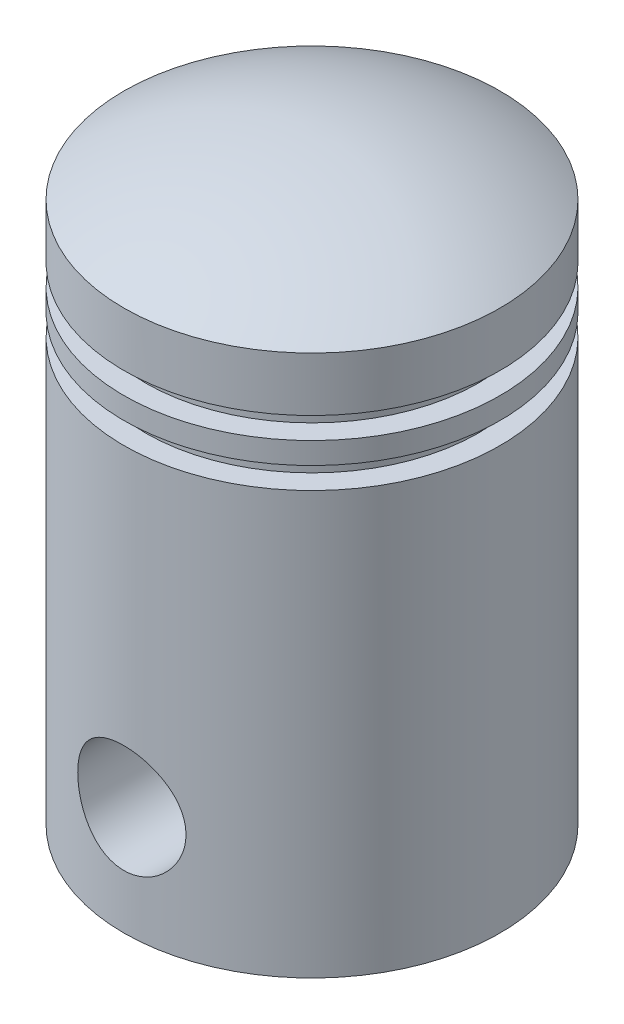
ISO-10303-21;
HEADER;
FILE_DESCRIPTION(('STEP AP214'),'2;1');
FILE_NAME('part.step','',(''),(''),'','','');
FILE_SCHEMA(('AUTOMOTIVE_DESIGN { 1 0 10303 214 1 1 1 1 }'));
ENDSEC;
DATA;
#1=APPLICATION_CONTEXT('core data for automotive mechanical design processes');
#2=APPLICATION_PROTOCOL_DEFINITION('international standard','automotive_design',2000,#1);
#3=PRODUCT_CONTEXT('',#1,'mechanical');
#4=PRODUCT('Part','Part','',(#3));
#5=PRODUCT_RELATED_PRODUCT_CATEGORY('part','',(#4));
#6=PRODUCT_DEFINITION_FORMATION('','',#4);
#7=PRODUCT_DEFINITION_CONTEXT('part definition',#1,'design');
#8=PRODUCT_DEFINITION('design','',#6,#7);
#9=PRODUCT_DEFINITION_SHAPE('','',#8);
#10=(LENGTH_UNIT() NAMED_UNIT(*) SI_UNIT(.MILLI.,.METRE.));
#11=(NAMED_UNIT(*) PLANE_ANGLE_UNIT() SI_UNIT($,.RADIAN.));
#12=(NAMED_UNIT(*) SI_UNIT($,.STERADIAN.) SOLID_ANGLE_UNIT());
#13=UNCERTAINTY_MEASURE_WITH_UNIT(LENGTH_MEASURE(1.E-05),#10,'distance_accuracy_value','');
#14=(GEOMETRIC_REPRESENTATION_CONTEXT(3) GLOBAL_UNCERTAINTY_ASSIGNED_CONTEXT((#13)) GLOBAL_UNIT_ASSIGNED_CONTEXT((#10,
#11,#12)) REPRESENTATION_CONTEXT('',''));
#15=CARTESIAN_POINT('',(0.,0.,0.));
#16=DIRECTION('',(0.,0.,1.));
#17=DIRECTION('',(1.,0.,0.));
#18=AXIS2_PLACEMENT_3D('',#15,#16,#17);
#19=CARTESIAN_POINT('',(0.,10.,61.));
#20=DIRECTION('',(0.,0.,-1.));
#21=DIRECTION('',(-1.,0.,0.));
#22=AXIS2_PLACEMENT_3D('',#19,#20,#21);
#23=CYLINDRICAL_SURFACE('',#22,5.);
#24=CARTESIAN_POINT('',(0.,15.,-17.375));
#25=CARTESIAN_POINT('',(0.274803665797188,14.9999953560896,-17.3749968494518));
#26=CARTESIAN_POINT('',(0.549654910382217,14.9772694129235,-17.3684175083818));
#27=CARTESIAN_POINT('',(1.09138590574731,14.8871608838095,-17.3428124485425));
#28=CARTESIAN_POINT('',(1.35826269308548,14.8197619071053,-17.3237821614929));
#29=CARTESIAN_POINT('',(1.87615076094793,14.6427203108892,-17.2753662325862));
#30=CARTESIAN_POINT('',(2.12718377001475,14.5331370766044,-17.2459951530051));
#31=CARTESIAN_POINT('',(2.60731151759561,14.2750724110926,-17.1799696757991));
#32=CARTESIAN_POINT('',(2.83640386715536,14.1265867506317,-17.143314486395));
#33=CARTESIAN_POINT('',(3.27224872741674,13.7907616582188,-17.0655570761435));
#34=CARTESIAN_POINT('',(3.47833400601289,13.6025761024138,-17.0243693110133));
#35=CARTESIAN_POINT('',(3.8564991987516,13.194498405289,-16.9427136059819));
#36=CARTESIAN_POINT('',(4.02857392886535,12.974601439206,-16.9022457766704));
#37=CARTESIAN_POINT('',(4.33724570475069,12.5038192408422,-16.8257185179076));
#38=CARTESIAN_POINT('',(4.47304620199927,12.2523927423824,-16.7897660310383));
#39=CARTESIAN_POINT('',(4.70017262956097,11.7290713461433,-16.7276109002903));
#40=CARTESIAN_POINT('',(4.79150828292429,11.4571809381989,-16.7014061251925));
#41=CARTESIAN_POINT('',(4.92473989845127,10.9081048394319,-16.6626017589769));
#42=CARTESIAN_POINT('',(4.96785845141203,10.6312401464834,-16.6496664483674));
#43=CARTESIAN_POINT('',(5.00724747654957,10.0739277355271,-16.6378651769945));
#44=CARTESIAN_POINT('',(5.00352829112999,9.79348082218466,-16.6389961102142));
#45=CARTESIAN_POINT('',(4.95031158965818,9.24675164295637,-16.6549008792998));
#46=CARTESIAN_POINT('',(4.90232539797121,8.9803070299427,-16.6692242843738));
#47=CARTESIAN_POINT('',(4.76437056984278,8.45942168190412,-16.7091742550488));
#48=CARTESIAN_POINT('',(4.67439808899332,8.20498204844571,-16.7348018556888));
#49=CARTESIAN_POINT('',(4.45386726986537,7.71154102885447,-16.7948457986021));
#50=CARTESIAN_POINT('',(4.32280387035666,7.47277911364038,-16.8293705023842));
#51=CARTESIAN_POINT('',(4.02416306710636,7.02012156271584,-16.903264184722));
#52=CARTESIAN_POINT('',(3.8565774315096,6.80623154965192,-16.942634254517));
#53=CARTESIAN_POINT('',(3.48205907244744,6.40079264769588,-17.0236278293043));
#54=CARTESIAN_POINT('',(3.27386628876869,6.21041156572744,-17.06527992096));
#55=CARTESIAN_POINT('',(2.8279925176001,5.86700557845638,-17.1448036671692));
#56=CARTESIAN_POINT('',(2.59030995870876,5.71398266512344,-17.1826751200722));
#57=CARTESIAN_POINT('',(2.09020090010304,5.44900310992496,-17.2506709154384));
#58=CARTESIAN_POINT('',(1.8276401476164,5.33728733450106,-17.2807495217852));
#59=CARTESIAN_POINT('',(1.28639428172884,5.15993467177116,-17.3294410244882));
#60=CARTESIAN_POINT('',(1.00771331318962,5.09428599610606,-17.3480568539667));
#61=CARTESIAN_POINT('',(0.452079988277045,5.01283308954668,-17.3712690450966));
#62=CARTESIAN_POINT('',(0.175378174945523,4.99544432565985,-17.3763109123619));
#63=CARTESIAN_POINT('',(-0.376998979302229,5.00658842814801,-17.3731041770712));
#64=CARTESIAN_POINT('',(-0.652674441217238,5.035115697726,-17.3648571943195));
#65=CARTESIAN_POINT('',(-1.1893163258651,5.13599318072851,-17.3362897283603));
#66=CARTESIAN_POINT('',(-1.4504683981028,5.20743347320087,-17.3162200968852));
#67=CARTESIAN_POINT('',(-1.95703641016133,5.39102883408685,-17.2663103340338));
#68=CARTESIAN_POINT('',(-2.20245051514497,5.50318863973554,-17.2364690658825));
#69=CARTESIAN_POINT('',(-2.6765310907252,5.76780378273363,-17.1693163144329));
#70=CARTESIAN_POINT('',(-2.90471403653448,5.92108657440245,-17.1318557589579));
#71=CARTESIAN_POINT('',(-3.33266570638841,6.26257835358831,-17.0537785628933));
#72=CARTESIAN_POINT('',(-3.5324278540059,6.45079540156883,-17.0131611951847));
#73=CARTESIAN_POINT('',(-3.9047337965831,6.86424327683104,-16.9316641750232));
#74=CARTESIAN_POINT('',(-4.07615310497886,7.09049589564904,-16.8908206239896));
#75=CARTESIAN_POINT('',(-4.37864968226352,7.56943764128848,-16.8149475744567));
#76=CARTESIAN_POINT('',(-4.50972831281051,7.82212587541707,-16.7799178797349));
#77=CARTESIAN_POINT('',(-4.72687354444111,8.34574825765644,-16.7200475770686));
#78=CARTESIAN_POINT('',(-4.81317522838912,8.61657850793913,-16.695153905687));
#79=CARTESIAN_POINT('',(-4.93873352147709,9.16976484134921,-16.6584482338485));
#80=CARTESIAN_POINT('',(-4.97800464385883,9.45211734097863,-16.6466321978272));
#81=CARTESIAN_POINT('',(-5.00745569115569,10.0087180914069,-16.6377948518647));
#82=CARTESIAN_POINT('',(-4.99945838965416,10.282862499954,-16.6402241803358));
#83=CARTESIAN_POINT('',(-4.93890404282926,10.8257186476803,-16.6582960895213));
#84=CARTESIAN_POINT('',(-4.88634852483817,11.0944305727467,-16.6739382173373));
#85=CARTESIAN_POINT('',(-4.73930282057359,11.6160755991456,-16.7163199191876));
#86=CARTESIAN_POINT('',(-4.64525867530073,11.869144736796,-16.7429412633489));
#87=CARTESIAN_POINT('',(-4.41825049647195,12.3561128298642,-16.8042687775746));
#88=CARTESIAN_POINT('',(-4.28527949255895,12.5900083423871,-16.8389763953635));
#89=CARTESIAN_POINT('',(-3.97892003422897,13.0405411977054,-16.9140313076714));
#90=CARTESIAN_POINT('',(-3.8043167626329,13.2563273515792,-16.9545296367241));
#91=CARTESIAN_POINT('',(-3.42188242030569,13.6561284623108,-17.0358299573731));
#92=CARTESIAN_POINT('',(-3.21404295847298,13.8401353714334,-17.0766320231666));
#93=CARTESIAN_POINT('',(-2.76448476451399,14.1759271210124,-17.1552206448432));
#94=CARTESIAN_POINT('',(-2.52202224147647,14.3267435748773,-17.1929004497483));
#95=CARTESIAN_POINT('',(-2.01409873033801,14.5852487174374,-17.259764276906));
#96=CARTESIAN_POINT('',(-1.74865015139603,14.6929605020505,-17.2889528465527));
#97=CARTESIAN_POINT('',(-1.23748735581801,14.85084986106,-17.33252456407));
#98=CARTESIAN_POINT('',(-0.993614127241907,14.9066381343212,-17.3483272895209));
#99=CARTESIAN_POINT('',(-0.49983982676936,14.9812127592001,-17.3695657239762));
#100=CARTESIAN_POINT('',(-0.249939592630444,15.0000042237321,-17.3750028654884));
#101=CARTESIAN_POINT('',(0.,15.,-17.375));
#102=B_SPLINE_CURVE_WITH_KNOTS('',3,(#24,#25,#26,#27,#28,#29,#30,#31,#32,#33,#34,#35,#36,#37,
#38,#39,#40,#41,#42,#43,#44,#45,#46,#47,#48,#49,#50,#51,#52,#53,#54,#55,#56,#57,#58,#59,#60,#61,
#62,#63,#64,#65,#66,#67,#68,#69,#70,#71,#72,#73,#74,#75,#76,#77,#78,#79,#80,#81,#82,#83,#84,#85,
#86,#87,#88,#89,#90,#91,#92,#93,#94,#95,#96,#97,#98,#99,#100,#101),.UNSPECIFIED.,.T.,.F.,(4,2,2,
2,2,2,2,2,2,2,2,2,2,2,2,2,2,2,2,2,2,2,2,2,2,2,2,2,2,2,2,2,2,2,2,2,2,2,4),(0.,0.823493485504367,
1.64728928220667,2.4699295899075,3.29265936716686,4.13511290685633,4.97769475794746,
5.83748893163841,6.69709501108777,7.53437245641936,8.37146502285351,9.18099557035016,
9.99060025577631,10.8105742965049,11.6307333451127,12.4822703526944,13.3338527550502,
14.1903253146117,15.0465786267794,15.8743655845801,16.7020516494168,17.5127782071142,
18.3235991135241,19.1521489324596,19.9808901628427,20.8371589367264,21.6933988049678,
22.5450966544535,23.3965316092562,24.2153531477136,25.0341466203709,25.844344041214,
26.6546866272063,27.4924347474249,28.3303947078152,29.1902663485709,30.0496766425374,
30.7987644547742,31.5477487367113),.UNSPECIFIED.);
#103=CARTESIAN_POINT('',(0.,15.,-17.375));
#104=VERTEX_POINT('',#103);
#105=EDGE_CURVE('E157',#104,#104,#102,.T.);
#106=ORIENTED_EDGE('',*,*,#105,.T.);
#107=EDGE_LOOP('',(#106));
#108=FACE_BOUND('',#107,.T.);
#109=CARTESIAN_POINT('',(0.,10.,-5.25));
#110=DIRECTION('',(0.,0.,1.));
#111=DIRECTION('',(1.,0.,0.));
#112=AXIS2_PLACEMENT_3D('',#109,#110,#111);
#113=CIRCLE('',#112,5.);
#114=CARTESIAN_POINT('',(5.,10.,-5.25));
#115=VERTEX_POINT('',#114);
#116=EDGE_CURVE('E53',#115,#115,#113,.T.);
#117=ORIENTED_EDGE('',*,*,#116,.T.);
#118=EDGE_LOOP('',(#117));
#119=FACE_BOUND('',#118,.T.);
#120=ADVANCED_FACE('F43',(#108,#119),#23,.F.);
#121=CARTESIAN_POINT('',(0.,30.,0.));
#122=DIRECTION('',(0.,-1.,0.));
#123=DIRECTION('',(0.,0.,-1.));
#124=AXIS2_PLACEMENT_3D('',#121,#122,#123);
#125=CYLINDRICAL_SURFACE('',#124,17.375);
#126=CARTESIAN_POINT('',(0.,39.,0.));
#127=DIRECTION('',(0.,1.,0.));
#128=DIRECTION('',(-1.,0.,0.));
#129=AXIS2_PLACEMENT_3D('',#126,#127,#128);
#130=CIRCLE('',#129,17.375);
#131=CARTESIAN_POINT('',(-17.375,39.,0.));
#132=VERTEX_POINT('',#131);
#133=EDGE_CURVE('E231',#132,#132,#130,.T.);
#134=ORIENTED_EDGE('',*,*,#133,.F.);
#135=EDGE_LOOP('',(#134));
#136=FACE_BOUND('',#135,.T.);
#137=CARTESIAN_POINT('',(0.,0.,0.));
#138=DIRECTION('',(0.,1.,0.));
#139=DIRECTION('',(0.,0.,1.));
#140=AXIS2_PLACEMENT_3D('',#137,#138,#139);
#141=CIRCLE('',#140,17.375);
#142=CARTESIAN_POINT('',(0.,0.,17.375));
#143=VERTEX_POINT('',#142);
#144=EDGE_CURVE('E146',#143,#143,#141,.T.);
#145=ORIENTED_EDGE('',*,*,#144,.T.);
#146=EDGE_LOOP('',(#145));
#147=FACE_BOUND('',#146,.T.);
#148=CARTESIAN_POINT('',(-5.,10.,16.6400307992503));
#149=CARTESIAN_POINT('',(-4.99999525716068,9.7254621954191,16.6400345159178));
#150=CARTESIAN_POINT('',(-4.97731172467405,9.45087665369905,16.6468993825915));
#151=CARTESIAN_POINT('',(-4.88738690152679,8.90969629404709,16.6735180961936));
#152=CARTESIAN_POINT('',(-4.82012795021828,8.64310468706407,16.6932770516739));
#153=CARTESIAN_POINT('',(-4.64349540168212,8.12582224138139,16.7432648342782));
#154=CARTESIAN_POINT('',(-4.53418769515179,7.87510723623176,16.773477273308));
#155=CARTESIAN_POINT('',(-4.27677346834617,7.39552035466616,16.8409461691814));
#156=CARTESIAN_POINT('',(-4.12866216861865,7.1666511737491,16.8782034935887));
#157=CARTESIAN_POINT('',(-3.79322961056801,6.73058867006598,16.9567805734659));
#158=CARTESIAN_POINT('',(-3.60497784046313,6.52412559393461,16.9981815165153));
#159=CARTESIAN_POINT('',(-3.19660496853646,6.14522155007378,17.0796847794276));
#160=CARTESIAN_POINT('',(-2.97648009028839,5.97278461959761,17.1197869447173));
#161=CARTESIAN_POINT('',(-2.50546442002176,5.66370468905048,17.1950903076331));
#162=CARTESIAN_POINT('',(-2.25407108965025,5.52779921257167,17.2301846397129));
#163=CARTESIAN_POINT('',(-1.73081948159774,5.30046991740052,17.2905793610852));
#164=CARTESIAN_POINT('',(-1.45896526079851,5.20903730754228,17.3158816858088));
#165=CARTESIAN_POINT('',(-0.910142263572716,5.07564556442862,17.3532672075266));
#166=CARTESIAN_POINT('',(-0.633499077091944,5.03244154934749,17.3656824220351));
#167=CARTESIAN_POINT('',(-0.0766309746435052,4.9928045528266,17.3770609257949));
#168=CARTESIAN_POINT('',(0.203593236614113,4.99636250649441,17.3760268222214));
#169=CARTESIAN_POINT('',(0.750961577795428,5.04929722428507,17.3608611661829));
#170=CARTESIAN_POINT('',(1.01824828821092,5.09732712058704,17.3471146347238));
#171=CARTESIAN_POINT('',(1.54079379450686,5.23565143426215,17.3085314223379));
#172=CARTESIAN_POINT('',(1.79605185294009,5.3259484392275,17.2836940624351));
#173=CARTESIAN_POINT('',(2.29058515980903,5.54720067407008,17.2251730116118));
#174=CARTESIAN_POINT('',(2.52965287390409,5.67859371666322,17.1913946948323));
#175=CARTESIAN_POINT('',(2.98278814670048,5.97796610496466,17.1185964744846));
#176=CARTESIAN_POINT('',(3.19685014544695,6.1459535636478,17.0795754093366));
#177=CARTESIAN_POINT('',(3.60193822574205,6.52079553189311,16.9988493282479));
#178=CARTESIAN_POINT('',(3.79187356894781,6.72882036218598,16.9570982158442));
#179=CARTESIAN_POINT('',(4.13445539986945,7.17418783211615,16.8768464123206));
#180=CARTESIAN_POINT('',(4.28709877065497,7.41153291989893,16.8383459930754));
#181=CARTESIAN_POINT('',(4.55178150655751,7.91148083749749,16.7687469800498));
#182=CARTESIAN_POINT('',(4.66347760081267,8.1742748486141,16.7377116801209));
#183=CARTESIAN_POINT('',(4.840723389907,8.71603649180832,16.6873188130451));
#184=CARTESIAN_POINT('',(4.90628673835373,8.99499931203056,16.6679577909813));
#185=CARTESIAN_POINT('',(4.98742789660166,9.55086616974935,16.6438556094037));
#186=CARTESIAN_POINT('',(5.00465205374777,9.82750924397635,16.6386331432651));
#187=CARTESIAN_POINT('',(4.99320025162475,10.379732848764,16.6420737193981));
#188=CARTESIAN_POINT('',(4.964530114765,10.6553135096624,16.6507350002994));
#189=CARTESIAN_POINT('',(4.86356446864224,11.1909249700985,16.6804975283899));
#190=CARTESIAN_POINT('',(4.79230204105388,11.4511685342522,16.7013039235098));
#191=CARTESIAN_POINT('',(4.60935864899057,11.9559968972011,16.7527134188619));
#192=CARTESIAN_POINT('',(4.49767179315976,12.2005794074752,16.7833179469745));
#193=CARTESIAN_POINT('',(4.23384475532536,12.6739117440536,16.8518292450557));
#194=CARTESIAN_POINT('',(4.08076152226328,12.902111663527,16.8898996951921));
#195=CARTESIAN_POINT('',(3.73962544091117,13.3301870905224,16.9686892849892));
#196=CARTESIAN_POINT('',(3.55156490169138,13.5300563515376,17.0094090058978));
#197=CARTESIAN_POINT('',(3.13811930982599,13.9028577288666,17.0906008153175));
#198=CARTESIAN_POINT('',(2.91167465106764,14.0746297136642,17.1310164256263));
#199=CARTESIAN_POINT('',(2.43222877394767,14.3777484242522,17.2056286668325));
#200=CARTESIAN_POINT('',(2.17922893745659,14.5090972521737,17.2398256210818));
#201=CARTESIAN_POINT('',(1.65559694061555,14.7263840914867,17.2979307586663));
#202=CARTESIAN_POINT('',(1.38511634030065,14.8126655713494,17.3219164963802));
#203=CARTESIAN_POINT('',(0.832688395845388,14.9383006462809,17.3572392346554));
#204=CARTESIAN_POINT('',(0.550744067708742,14.9776665028675,17.3685795400827));
#205=CARTESIAN_POINT('',(-0.00584429139688044,15.0074816832673,17.3771494413301));
#206=CARTESIAN_POINT('',(-0.280391507399142,14.9996203063924,17.3748663603682));
#207=CARTESIAN_POINT('',(-0.824090615254842,14.939198498751,17.3575769634608));
#208=CARTESIAN_POINT('',(-1.09324277134507,14.8866402626292,17.3425712722038));
#209=CARTESIAN_POINT('',(-1.6161286967809,14.7393304434099,17.3016462935351));
#210=CARTESIAN_POINT('',(-1.86998137189934,14.6449708184157,17.2758285077897));
#211=CARTESIAN_POINT('',(-2.35839113553933,14.4170855678494,17.2159584272664));
#212=CARTESIAN_POINT('',(-2.59294520146898,14.2835538219465,17.1819048458573));
#213=CARTESIAN_POINT('',(-3.0437568435708,13.9764495297923,17.1078915780948));
#214=CARTESIAN_POINT('',(-3.2592522995672,13.8017938352495,17.0677851032762));
#215=CARTESIAN_POINT('',(-3.65844383841474,13.4193889041844,16.9867003603342));
#216=CARTESIAN_POINT('',(-3.84213105447433,13.2116304709096,16.9457218526881));
#217=CARTESIAN_POINT('',(-4.17740412123777,12.7622384339156,16.866252059738));
#218=CARTESIAN_POINT('',(-4.3279994463636,12.5198471303357,16.8278566720995));
#219=CARTESIAN_POINT('',(-4.58610857874086,12.0121147195044,16.7593608069719));
#220=CARTESIAN_POINT('',(-4.69364602739076,11.746786303705,16.7292557804123));
#221=CARTESIAN_POINT('',(-4.85120378775155,11.2360295616643,16.6841917170538));
#222=CARTESIAN_POINT('',(-4.90685762360439,10.9924549134477,16.6677789965405));
#223=CARTESIAN_POINT('',(-4.98125487093692,10.4992660062234,16.6456977254524));
#224=CARTESIAN_POINT('',(-5.00000431293182,10.2496527407305,16.6400274194746));
#225=CARTESIAN_POINT('',(-5.,10.,16.6400307992503));
#226=B_SPLINE_CURVE_WITH_KNOTS('',3,(#148,#149,#150,#151,#152,#153,#154,#155,#156,#157,#158,
#159,#160,#161,#162,#163,#164,#165,#166,#167,#168,#169,#170,#171,#172,#173,#174,#175,#176,#177,
#178,#179,#180,#181,#182,#183,#184,#185,#186,#187,#188,#189,#190,#191,#192,#193,#194,#195,#196,
#197,#198,#199,#200,#201,#202,#203,#204,#205,#206,#207,#208,#209,#210,#211,#212,#213,#214,#215,
#216,#217,#218,#219,#220,#221,#222,#223,#224,#225),.UNSPECIFIED.,.T.,.F.,(4,2,2,2,2,2,2,2,2,2,2,
2,2,2,2,2,2,2,2,2,2,2,2,2,2,2,2,2,2,2,2,2,2,2,2,2,2,2,4),(0.,0.822693628475323,1.64571340072321,
2.4674487143813,3.2892852890902,4.13278161173297,4.97637795638123,5.83590674965219,
6.69526556660307,7.53188905124655,8.36835035730329,9.18027931847691,9.99225799244033,
10.8131998915188,11.6343239788187,12.4846664833761,13.335080036798,14.192468052082,
15.0496022049769,15.8771674348064,16.7046276833565,17.5127888623217,18.3210678681473,
19.1495891390934,19.978292803972,20.8354422711727,21.6925471563745,22.543020864546,
23.3932722504688,24.2132959599503,25.0332794080611,25.8457317228311,26.6583110444517,
27.495321110106,28.3325641244641,29.1922108647167,30.0513849571319,30.799629046676,
31.5477508561438),.UNSPECIFIED.);
#227=CARTESIAN_POINT('',(-5.,10.,16.6400307992503));
#228=VERTEX_POINT('',#227);
#229=EDGE_CURVE('E141',#228,#228,#226,.T.);
#230=ORIENTED_EDGE('',*,*,#229,.F.);
#231=EDGE_LOOP('',(#230));
#232=FACE_BOUND('',#231,.T.);
#233=ORIENTED_EDGE('',*,*,#105,.F.);
#234=EDGE_LOOP('',(#233));
#235=FACE_BOUND('',#234,.T.);
#236=ADVANCED_FACE('F162',(#136,#147,#232,#235),#125,.T.);
#237=CARTESIAN_POINT('',(0.,0.,0.));
#238=DIRECTION('',(0.,1.,0.));
#239=DIRECTION('',(0.,0.,1.));
#240=AXIS2_PLACEMENT_3D('',#237,#238,#239);
#241=PLANE('',#240);
#242=DIRECTION('',(0.,0.,-1.));
#243=VECTOR('',#242,1.);
#244=CARTESIAN_POINT('',(-12.375,0.,0.));
#245=LINE('',#244,#243);
#246=CARTESIAN_POINT('',(-12.375,0.,5.25));
#247=VERTEX_POINT('',#246);
#248=CARTESIAN_POINT('',(-12.375,0.,-5.25));
#249=VERTEX_POINT('',#248);
#250=EDGE_CURVE('E92',#247,#249,#245,.T.);
#251=ORIENTED_EDGE('',*,*,#250,.F.);
#252=DIRECTION('',(-1.,0.,0.));
#253=VECTOR('',#252,1.);
#254=CARTESIAN_POINT('',(0.,0.,5.25));
#255=LINE('',#254,#253);
#256=CARTESIAN_POINT('',(12.375,0.,5.25));
#257=VERTEX_POINT('',#256);
#258=EDGE_CURVE('E60',#257,#247,#255,.T.);
#259=ORIENTED_EDGE('',*,*,#258,.F.);
#260=DIRECTION('',(0.,0.,-1.));
#261=VECTOR('',#260,1.);
#262=CARTESIAN_POINT('',(12.375,0.,0.));
#263=LINE('',#262,#261);
#264=CARTESIAN_POINT('',(12.375,0.,-5.25));
#265=VERTEX_POINT('',#264);
#266=EDGE_CURVE('E135',#257,#265,#263,.T.);
#267=ORIENTED_EDGE('',*,*,#266,.T.);
#268=DIRECTION('',(-1.,0.,0.));
#269=VECTOR('',#268,1.);
#270=CARTESIAN_POINT('',(0.,0.,-5.25));
#271=LINE('',#270,#269);
#272=EDGE_CURVE('E132',#265,#249,#271,.T.);
#273=ORIENTED_EDGE('',*,*,#272,.T.);
#274=EDGE_LOOP('',(#251,#259,#267,#273));
#275=FACE_BOUND('',#274,.T.);
#276=ORIENTED_EDGE('',*,*,#144,.F.);
#277=EDGE_LOOP('',(#276));
#278=FACE_BOUND('',#277,.T.);
#279=ADVANCED_FACE('F170',(#275,#278),#241,.F.);
#280=CARTESIAN_POINT('',(0.,10.,5.25));
#281=DIRECTION('',(0.,0.,1.));
#282=DIRECTION('',(1.,0.,0.));
#283=AXIS2_PLACEMENT_3D('',#280,#281,#282);
#284=CIRCLE('',#283,5.);
#285=CARTESIAN_POINT('',(5.,10.,5.25));
#286=VERTEX_POINT('',#285);
#287=EDGE_CURVE('E11',#286,#286,#284,.T.);
#288=ORIENTED_EDGE('',*,*,#287,.F.);
#289=EDGE_LOOP('',(#288));
#290=FACE_BOUND('',#289,.T.);
#291=ORIENTED_EDGE('',*,*,#229,.T.);
#292=EDGE_LOOP('',(#291));
#293=FACE_BOUND('',#292,.T.);
#294=ADVANCED_FACE('F165',(#290,#293),#23,.F.);
#295=CARTESIAN_POINT('',(0.,15.,5.25));
#296=DIRECTION('',(0.,0.,1.));
#297=DIRECTION('',(1.,0.,0.));
#298=AXIS2_PLACEMENT_3D('',#295,#296,#297);
#299=PLANE('',#298);
#300=DIRECTION('',(0.,-1.,0.));
#301=VECTOR('',#300,1.);
#302=CARTESIAN_POINT('',(-12.375,15.,5.25));
#303=LINE('',#302,#301);
#304=CARTESIAN_POINT('',(-12.375,24.,5.25));
#305=VERTEX_POINT('',#304);
#306=EDGE_CURVE('E98',#305,#247,#303,.T.);
#307=ORIENTED_EDGE('',*,*,#306,.F.);
#308=DIRECTION('',(-1.,0.,0.));
#309=VECTOR('',#308,1.);
#310=CARTESIAN_POINT('',(-12.375,24.,5.25));
#311=LINE('',#310,#309);
#312=CARTESIAN_POINT('',(12.375,24.,5.25));
#313=VERTEX_POINT('',#312);
#314=EDGE_CURVE('E111',#313,#305,#311,.T.);
#315=ORIENTED_EDGE('',*,*,#314,.F.);
#316=DIRECTION('',(0.,-1.,0.));
#317=VECTOR('',#316,1.);
#318=CARTESIAN_POINT('',(12.375,15.,5.25));
#319=LINE('',#318,#317);
#320=EDGE_CURVE('E65',#313,#257,#319,.T.);
#321=ORIENTED_EDGE('',*,*,#320,.T.);
#322=ORIENTED_EDGE('',*,*,#258,.T.);
#323=EDGE_LOOP('',(#307,#315,#321,#322));
#324=FACE_BOUND('',#323,.T.);
#325=ORIENTED_EDGE('',*,*,#287,.T.);
#326=EDGE_LOOP('',(#325));
#327=FACE_BOUND('',#326,.T.);
#328=ADVANCED_FACE('F169',(#324,#327),#299,.F.);
#329=CARTESIAN_POINT('',(12.375,15.,0.));
#330=DIRECTION('',(-1.,0.,0.));
#331=DIRECTION('',(0.,0.,1.));
#332=AXIS2_PLACEMENT_3D('',#329,#330,#331);
#333=PLANE('',#332);
#334=ORIENTED_EDGE('',*,*,#266,.F.);
#335=ORIENTED_EDGE('',*,*,#320,.F.);
#336=DIRECTION('',(0.,0.,1.));
#337=VECTOR('',#336,1.);
#338=CARTESIAN_POINT('',(12.375,24.,5.25));
#339=LINE('',#338,#337);
#340=CARTESIAN_POINT('',(12.375,24.,-5.25));
#341=VERTEX_POINT('',#340);
#342=EDGE_CURVE('E108',#341,#313,#339,.T.);
#343=ORIENTED_EDGE('',*,*,#342,.F.);
#344=DIRECTION('',(0.,-1.,0.));
#345=VECTOR('',#344,1.);
#346=CARTESIAN_POINT('',(12.375,15.,-5.25));
#347=LINE('',#346,#345);
#348=EDGE_CURVE('E97',#341,#265,#347,.T.);
#349=ORIENTED_EDGE('',*,*,#348,.T.);
#350=EDGE_LOOP('',(#334,#335,#343,#349));
#351=FACE_BOUND('',#350,.T.);
#352=ADVANCED_FACE('F284',(#351),#333,.T.);
#353=CARTESIAN_POINT('',(0.,15.,-5.25));
#354=DIRECTION('',(0.,0.,1.));
#355=DIRECTION('',(1.,0.,0.));
#356=AXIS2_PLACEMENT_3D('',#353,#354,#355);
#357=PLANE('',#356);
#358=DIRECTION('',(1.,0.,0.));
#359=VECTOR('',#358,1.);
#360=CARTESIAN_POINT('',(-12.375,24.,-5.25));
#361=LINE('',#360,#359);
#362=CARTESIAN_POINT('',(-12.375,24.,-5.25));
#363=VERTEX_POINT('',#362);
#364=EDGE_CURVE('E101',#363,#341,#361,.T.);
#365=ORIENTED_EDGE('',*,*,#364,.F.);
#366=DIRECTION('',(0.,-1.,0.));
#367=VECTOR('',#366,1.);
#368=CARTESIAN_POINT('',(-12.375,15.,-5.25));
#369=LINE('',#368,#367);
#370=EDGE_CURVE('E85',#363,#249,#369,.T.);
#371=ORIENTED_EDGE('',*,*,#370,.T.);
#372=ORIENTED_EDGE('',*,*,#272,.F.);
#373=ORIENTED_EDGE('',*,*,#348,.F.);
#374=EDGE_LOOP('',(#365,#371,#372,#373));
#375=FACE_BOUND('',#374,.T.);
#376=ORIENTED_EDGE('',*,*,#116,.F.);
#377=EDGE_LOOP('',(#376));
#378=FACE_BOUND('',#377,.T.);
#379=ADVANCED_FACE('F102',(#375,#378),#357,.T.);
#380=CARTESIAN_POINT('',(-12.375,15.,0.));
#381=DIRECTION('',(-1.,0.,0.));
#382=DIRECTION('',(0.,0.,1.));
#383=AXIS2_PLACEMENT_3D('',#380,#381,#382);
#384=PLANE('',#383);
#385=ORIENTED_EDGE('',*,*,#250,.T.);
#386=ORIENTED_EDGE('',*,*,#370,.F.);
#387=DIRECTION('',(0.,0.,-1.));
#388=VECTOR('',#387,1.);
#389=CARTESIAN_POINT('',(-12.375,24.,5.25));
#390=LINE('',#389,#388);
#391=EDGE_CURVE('E89',#305,#363,#390,.T.);
#392=ORIENTED_EDGE('',*,*,#391,.F.);
#393=ORIENTED_EDGE('',*,*,#306,.T.);
#394=EDGE_LOOP('',(#385,#386,#392,#393));
#395=FACE_BOUND('',#394,.T.);
#396=ADVANCED_FACE('F87',(#395),#384,.F.);
#397=CARTESIAN_POINT('',(0.,24.,0.));
#398=DIRECTION('',(0.,-1.,0.));
#399=DIRECTION('',(0.,0.,-1.));
#400=AXIS2_PLACEMENT_3D('',#397,#398,#399);
#401=PLANE('',#400);
#402=ORIENTED_EDGE('',*,*,#391,.T.);
#403=ORIENTED_EDGE('',*,*,#364,.T.);
#404=ORIENTED_EDGE('',*,*,#342,.T.);
#405=ORIENTED_EDGE('',*,*,#314,.T.);
#406=EDGE_LOOP('',(#402,#403,#404,#405));
#407=FACE_BOUND('',#406,.T.);
#408=ADVANCED_FACE('F110',(#407),#401,.T.);
#409=CARTESIAN_POINT('',(-17.375,39.,0.));
#410=DIRECTION('',(0.,-1.,0.));
#411=DIRECTION('',(1.,0.,0.));
#412=AXIS2_PLACEMENT_3D('',#409,#410,#411);
#413=PLANE('',#412);
#414=CARTESIAN_POINT('',(0.,39.,0.));
#415=DIRECTION('',(0.,1.,0.));
#416=DIRECTION('',(-1.,0.,0.));
#417=AXIS2_PLACEMENT_3D('',#414,#415,#416);
#418=CIRCLE('',#417,15.375);
#419=CARTESIAN_POINT('',(-15.375,39.,0.));
#420=VERTEX_POINT('',#419);
#421=EDGE_CURVE('E121',#420,#420,#418,.T.);
#422=ORIENTED_EDGE('',*,*,#421,.F.);
#423=EDGE_LOOP('',(#422));
#424=FACE_BOUND('',#423,.T.);
#425=ORIENTED_EDGE('',*,*,#133,.T.);
#426=EDGE_LOOP('',(#425));
#427=FACE_BOUND('',#426,.T.);
#428=ADVANCED_FACE('F271',(#424,#427),#413,.F.);
#429=CARTESIAN_POINT('',(-17.375,41.,0.));
#430=DIRECTION('',(0.,-1.,0.));
#431=DIRECTION('',(1.,0.,0.));
#432=AXIS2_PLACEMENT_3D('',#429,#430,#431);
#433=PLANE('',#432);
#434=CARTESIAN_POINT('',(0.,41.,0.));
#435=DIRECTION('',(0.,1.,0.));
#436=DIRECTION('',(-1.,0.,0.));
#437=AXIS2_PLACEMENT_3D('',#434,#435,#436);
#438=CIRCLE('',#437,15.375);
#439=CARTESIAN_POINT('',(-15.375,41.,0.));
#440=VERTEX_POINT('',#439);
#441=EDGE_CURVE('E238',#440,#440,#438,.T.);
#442=ORIENTED_EDGE('',*,*,#441,.T.);
#443=EDGE_LOOP('',(#442));
#444=FACE_BOUND('',#443,.T.);
#445=CARTESIAN_POINT('',(0.,41.,0.));
#446=DIRECTION('',(0.,1.,0.));
#447=DIRECTION('',(-1.,0.,0.));
#448=AXIS2_PLACEMENT_3D('',#445,#446,#447);
#449=CIRCLE('',#448,17.375);
#450=CARTESIAN_POINT('',(-17.375,41.,0.));
#451=VERTEX_POINT('',#450);
#452=EDGE_CURVE('E235',#451,#451,#449,.T.);
#453=ORIENTED_EDGE('',*,*,#452,.F.);
#454=EDGE_LOOP('',(#453));
#455=FACE_BOUND('',#454,.T.);
#456=ADVANCED_FACE('F269',(#444,#455),#433,.T.);
#457=CARTESIAN_POINT('',(0.,55.,0.));
#458=DIRECTION('',(0.,1.,0.));
#459=DIRECTION('',(-1.,0.,0.));
#460=AXIS2_PLACEMENT_3D('',#457,#458,#459);
#461=CYLINDRICAL_SURFACE('',#460,15.375);
#462=ORIENTED_EDGE('',*,*,#421,.T.);
#463=EDGE_LOOP('',(#462));
#464=FACE_BOUND('',#463,.T.);
#465=ORIENTED_EDGE('',*,*,#441,.F.);
#466=EDGE_LOOP('',(#465));
#467=FACE_BOUND('',#466,.T.);
#468=ADVANCED_FACE('F266',(#464,#467),#461,.T.);
#469=CARTESIAN_POINT('',(0.,43.,0.));
#470=DIRECTION('',(0.,1.,0.));
#471=DIRECTION('',(-1.,0.,0.));
#472=AXIS2_PLACEMENT_3D('',#469,#470,#471);
#473=CIRCLE('',#472,17.375);
#474=CARTESIAN_POINT('',(-17.375,43.,0.));
#475=VERTEX_POINT('',#474);
#476=EDGE_CURVE('E222',#475,#475,#473,.T.);
#477=ORIENTED_EDGE('',*,*,#476,.F.);
#478=EDGE_LOOP('',(#477));
#479=FACE_BOUND('',#478,.T.);
#480=ORIENTED_EDGE('',*,*,#452,.T.);
#481=EDGE_LOOP('',(#480));
#482=FACE_BOUND('',#481,.T.);
#483=ADVANCED_FACE('F182',(#479,#482),#125,.T.);
#484=CARTESIAN_POINT('',(0.,55.,0.));
#485=DIRECTION('',(0.,1.,0.));
#486=DIRECTION('',(-1.,0.,0.));
#487=AXIS2_PLACEMENT_3D('',#484,#485,#486);
#488=CYLINDRICAL_SURFACE('',#487,15.375);
#489=CARTESIAN_POINT('',(0.,43.,0.));
#490=DIRECTION('',(0.,1.,0.));
#491=DIRECTION('',(-1.,0.,0.));
#492=AXIS2_PLACEMENT_3D('',#489,#490,#491);
#493=CIRCLE('',#492,15.375);
#494=CARTESIAN_POINT('',(-15.375,43.,0.));
#495=VERTEX_POINT('',#494);
#496=EDGE_CURVE('E227',#495,#495,#493,.T.);
#497=ORIENTED_EDGE('',*,*,#496,.T.);
#498=EDGE_LOOP('',(#497));
#499=FACE_BOUND('',#498,.T.);
#500=CARTESIAN_POINT('',(0.,45.,0.));
#501=DIRECTION('',(0.,1.,0.));
#502=DIRECTION('',(-1.,0.,0.));
#503=AXIS2_PLACEMENT_3D('',#500,#501,#502);
#504=CIRCLE('',#503,15.375);
#505=CARTESIAN_POINT('',(-15.375,45.,0.));
#506=VERTEX_POINT('',#505);
#507=EDGE_CURVE('E113',#506,#506,#504,.T.);
#508=ORIENTED_EDGE('',*,*,#507,.F.);
#509=EDGE_LOOP('',(#508));
#510=FACE_BOUND('',#509,.T.);
#511=ADVANCED_FACE('F254',(#499,#510),#488,.T.);
#512=CARTESIAN_POINT('',(0.,43.,0.));
#513=DIRECTION('',(0.,-1.,0.));
#514=DIRECTION('',(1.,0.,0.));
#515=AXIS2_PLACEMENT_3D('',#512,#513,#514);
#516=PLANE('',#515);
#517=ORIENTED_EDGE('',*,*,#496,.F.);
#518=EDGE_LOOP('',(#517));
#519=FACE_BOUND('',#518,.T.);
#520=ORIENTED_EDGE('',*,*,#476,.T.);
#521=EDGE_LOOP('',(#520));
#522=FACE_BOUND('',#521,.T.);
#523=ADVANCED_FACE('F257',(#519,#522),#516,.F.);
#524=CARTESIAN_POINT('',(0.,45.,0.));
#525=DIRECTION('',(0.,-1.,0.));
#526=DIRECTION('',(1.,0.,0.));
#527=AXIS2_PLACEMENT_3D('',#524,#525,#526);
#528=PLANE('',#527);
#529=ORIENTED_EDGE('',*,*,#507,.T.);
#530=EDGE_LOOP('',(#529));
#531=FACE_BOUND('',#530,.T.);
#532=CARTESIAN_POINT('',(0.,45.,0.));
#533=DIRECTION('',(0.,1.,0.));
#534=DIRECTION('',(-1.,0.,0.));
#535=AXIS2_PLACEMENT_3D('',#532,#533,#534);
#536=CIRCLE('',#535,17.375);
#537=CARTESIAN_POINT('',(-17.375,45.,0.));
#538=VERTEX_POINT('',#537);
#539=EDGE_CURVE('E118',#538,#538,#536,.T.);
#540=ORIENTED_EDGE('',*,*,#539,.F.);
#541=EDGE_LOOP('',(#540));
#542=FACE_BOUND('',#541,.T.);
#543=ADVANCED_FACE('F260',(#531,#542),#528,.T.);
#544=CARTESIAN_POINT('',(0.,22.3109375,0.));
#545=DIRECTION('',(0.,0.,1.));
#546=DIRECTION('',(1.,0.,0.));
#547=AXIS2_PLACEMENT_3D('',#544,#545,#546);
#548=SPHERICAL_SURFACE('',#547,32.6890625);
#549=CARTESIAN_POINT('',(0.,22.3109375,0.));
#550=DIRECTION('',(0.,1.,0.));
#551=DIRECTION('',(0.,0.,1.));
#552=AXIS2_PLACEMENT_3D('',#549,#550,#551);
#553=SPHERICAL_SURFACE('',#552,32.6890625);
#554=CARTESIAN_POINT('',(0.,50.,0.));
#555=DIRECTION('',(0.,1.,0.));
#556=DIRECTION('',(0.,0.,1.));
#557=AXIS2_PLACEMENT_3D('',#554,#555,#556);
#558=CIRCLE('',#557,17.375);
#559=CARTESIAN_POINT('',(0.,50.,17.375));
#560=VERTEX_POINT('',#559);
#561=EDGE_CURVE('E47',#560,#560,#558,.T.);
#562=ORIENTED_EDGE('',*,*,#561,.T.);
#563=EDGE_LOOP('',(#562));
#564=FACE_BOUND('',#563,.T.);
#565=ADVANCED_FACE('F45',(#564),#553,.T.);
#566=ORIENTED_EDGE('',*,*,#561,.F.);
#567=EDGE_LOOP('',(#566));
#568=FACE_BOUND('',#567,.T.);
#569=ORIENTED_EDGE('',*,*,#539,.T.);
#570=EDGE_LOOP('',(#569));
#571=FACE_BOUND('',#570,.T.);
#572=ADVANCED_FACE('F181',(#568,#571),#125,.T.);
#573=CLOSED_SHELL('',(#120,#236,#279,#294,#328,#352,#379,#396,#408,#428,#456,#468,#483,#511,
#523,#543,#565,#572));
#574=MANIFOLD_SOLID_BREP('B2',#573);
#575=ADVANCED_BREP_SHAPE_REPRESENTATION('',(#18,#574),#14);
#576=SHAPE_DEFINITION_REPRESENTATION(#9,#575);
ENDSEC;
END-ISO-10303-21;
